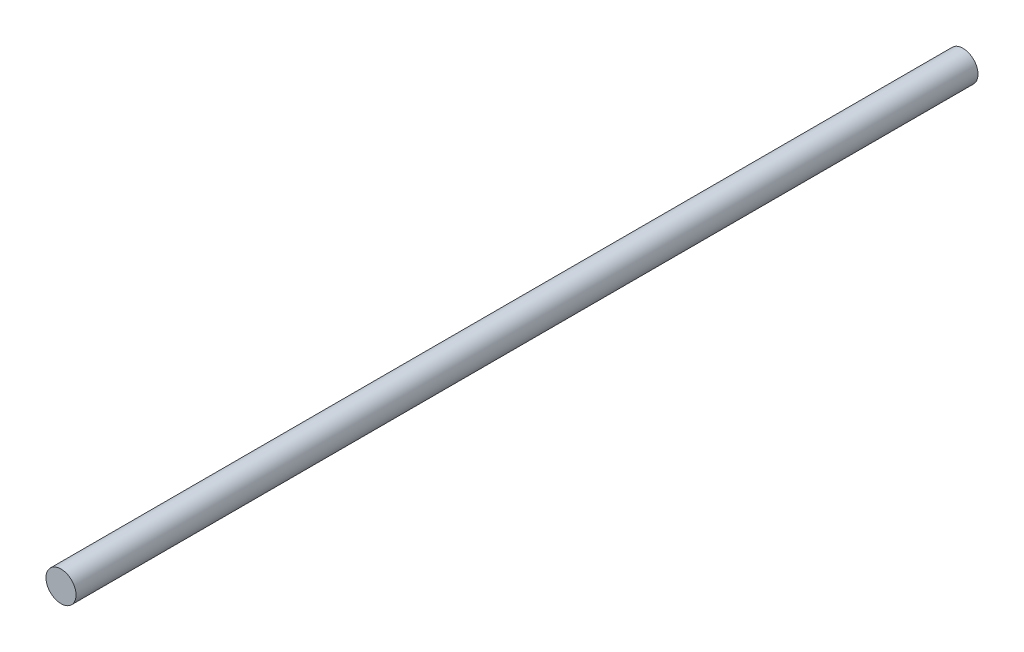
ISO-10303-21;
HEADER;
FILE_DESCRIPTION(('STEP AP214'),'2;1');
FILE_NAME('part.step','',(''),(''),'','','');
FILE_SCHEMA(('AUTOMOTIVE_DESIGN { 1 0 10303 214 1 1 1 1 }'));
ENDSEC;
DATA;
#1=APPLICATION_CONTEXT('core data for automotive mechanical design processes');
#2=APPLICATION_PROTOCOL_DEFINITION('international standard','automotive_design',2000,#1);
#3=PRODUCT_CONTEXT('',#1,'mechanical');
#4=PRODUCT('Part','Part','',(#3));
#5=PRODUCT_RELATED_PRODUCT_CATEGORY('part','',(#4));
#6=PRODUCT_DEFINITION_FORMATION('','',#4);
#7=PRODUCT_DEFINITION_CONTEXT('part definition',#1,'design');
#8=PRODUCT_DEFINITION('design','',#6,#7);
#9=PRODUCT_DEFINITION_SHAPE('','',#8);
#10=(LENGTH_UNIT() NAMED_UNIT(*) SI_UNIT(.MILLI.,.METRE.));
#11=(NAMED_UNIT(*) PLANE_ANGLE_UNIT() SI_UNIT($,.RADIAN.));
#12=(NAMED_UNIT(*) SI_UNIT($,.STERADIAN.) SOLID_ANGLE_UNIT());
#13=UNCERTAINTY_MEASURE_WITH_UNIT(LENGTH_MEASURE(1.E-05),#10,'distance_accuracy_value','');
#14=(GEOMETRIC_REPRESENTATION_CONTEXT(3) GLOBAL_UNCERTAINTY_ASSIGNED_CONTEXT((#13)) GLOBAL_UNIT_ASSIGNED_CONTEXT((#10,
#11,#12)) REPRESENTATION_CONTEXT('',''));
#15=CARTESIAN_POINT('',(0.,0.,0.));
#16=DIRECTION('',(0.,0.,1.));
#17=DIRECTION('',(1.,0.,0.));
#18=AXIS2_PLACEMENT_3D('',#15,#16,#17);
#19=CARTESIAN_POINT('',(0.,0.,30.));
#20=DIRECTION('',(0.,0.,-1.));
#21=DIRECTION('',(-1.,0.,0.));
#22=AXIS2_PLACEMENT_3D('',#19,#20,#21);
#23=CYLINDRICAL_SURFACE('',#22,0.5);
#24=CARTESIAN_POINT('',(0.,0.,30.));
#25=DIRECTION('',(0.,0.,1.));
#26=DIRECTION('',(1.,0.,0.));
#27=AXIS2_PLACEMENT_3D('',#24,#25,#26);
#28=CIRCLE('',#27,0.5);
#29=CARTESIAN_POINT('',(0.5,0.,30.));
#30=VERTEX_POINT('',#29);
#31=EDGE_CURVE('E10',#30,#30,#28,.T.);
#32=ORIENTED_EDGE('',*,*,#31,.F.);
#33=EDGE_LOOP('',(#32));
#34=FACE_BOUND('',#33,.T.);
#35=CARTESIAN_POINT('',(0.,0.,0.));
#36=DIRECTION('',(0.,0.,1.));
#37=DIRECTION('',(1.,0.,0.));
#38=AXIS2_PLACEMENT_3D('',#35,#36,#37);
#39=CIRCLE('',#38,0.5);
#40=CARTESIAN_POINT('',(0.5,0.,0.));
#41=VERTEX_POINT('',#40);
#42=EDGE_CURVE('E38',#41,#41,#39,.T.);
#43=ORIENTED_EDGE('',*,*,#42,.T.);
#44=EDGE_LOOP('',(#43));
#45=FACE_BOUND('',#44,.T.);
#46=ADVANCED_FACE('F35',(#34,#45),#23,.T.);
#47=CARTESIAN_POINT('',(0.,0.,30.));
#48=DIRECTION('',(0.,0.,1.));
#49=DIRECTION('',(1.,0.,0.));
#50=AXIS2_PLACEMENT_3D('',#47,#48,#49);
#51=PLANE('',#50);
#52=ORIENTED_EDGE('',*,*,#31,.T.);
#53=EDGE_LOOP('',(#52));
#54=FACE_BOUND('',#53,.T.);
#55=ADVANCED_FACE('F50',(#54),#51,.T.);
#56=CARTESIAN_POINT('',(0.,0.,0.));
#57=DIRECTION('',(0.,0.,1.));
#58=DIRECTION('',(1.,0.,0.));
#59=AXIS2_PLACEMENT_3D('',#56,#57,#58);
#60=PLANE('',#59);
#61=ORIENTED_EDGE('',*,*,#42,.F.);
#62=EDGE_LOOP('',(#61));
#63=FACE_BOUND('',#62,.T.);
#64=ADVANCED_FACE('F48',(#63),#60,.F.);
#65=CLOSED_SHELL('',(#46,#55,#64));
#66=MANIFOLD_SOLID_BREP('B2',#65);
#67=ADVANCED_BREP_SHAPE_REPRESENTATION('',(#18,#66),#14);
#68=SHAPE_DEFINITION_REPRESENTATION(#9,#67);
ENDSEC;
END-ISO-10303-21;
